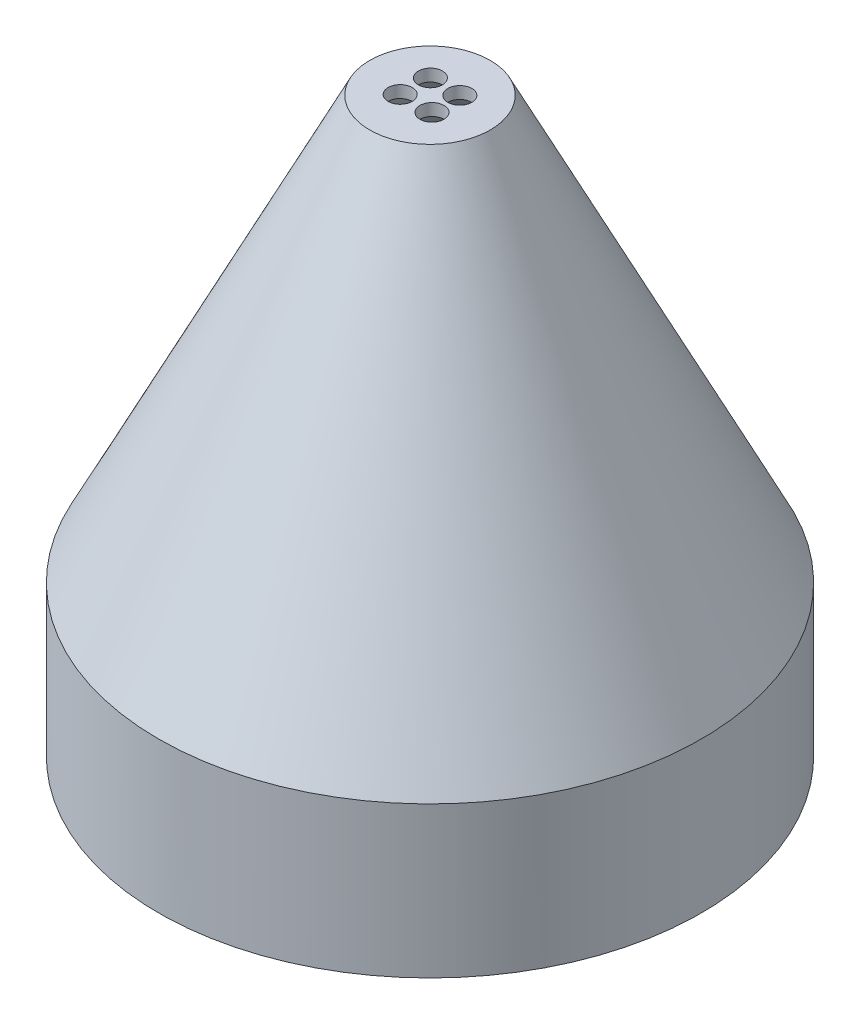
ISO-10303-21;
HEADER;
FILE_DESCRIPTION(('STEP AP214'),'2;1');
FILE_NAME('part.step','',(''),(''),'','','');
FILE_SCHEMA(('AUTOMOTIVE_DESIGN { 1 0 10303 214 1 1 1 1 }'));
ENDSEC;
DATA;
#1=APPLICATION_CONTEXT('core data for automotive mechanical design processes');
#2=APPLICATION_PROTOCOL_DEFINITION('international standard','automotive_design',2000,#1);
#3=PRODUCT_CONTEXT('',#1,'mechanical');
#4=PRODUCT('Part','Part','',(#3));
#5=PRODUCT_RELATED_PRODUCT_CATEGORY('part','',(#4));
#6=PRODUCT_DEFINITION_FORMATION('','',#4);
#7=PRODUCT_DEFINITION_CONTEXT('part definition',#1,'design');
#8=PRODUCT_DEFINITION('design','',#6,#7);
#9=PRODUCT_DEFINITION_SHAPE('','',#8);
#10=(LENGTH_UNIT() NAMED_UNIT(*) SI_UNIT(.MILLI.,.METRE.));
#11=(NAMED_UNIT(*) PLANE_ANGLE_UNIT() SI_UNIT($,.RADIAN.));
#12=(NAMED_UNIT(*) SI_UNIT($,.STERADIAN.) SOLID_ANGLE_UNIT());
#13=UNCERTAINTY_MEASURE_WITH_UNIT(LENGTH_MEASURE(1.E-05),#10,'distance_accuracy_value','');
#14=(GEOMETRIC_REPRESENTATION_CONTEXT(3) GLOBAL_UNCERTAINTY_ASSIGNED_CONTEXT((#13)) GLOBAL_UNIT_ASSIGNED_CONTEXT((#10,
#11,#12)) REPRESENTATION_CONTEXT('',''));
#15=CARTESIAN_POINT('',(0.,0.,0.));
#16=DIRECTION('',(0.,0.,1.));
#17=DIRECTION('',(1.,0.,0.));
#18=AXIS2_PLACEMENT_3D('',#15,#16,#17);
#19=CARTESIAN_POINT('',(0.,25.,0.));
#20=DIRECTION('',(0.,-1.,0.));
#21=DIRECTION('',(0.,0.,-1.));
#22=AXIS2_PLACEMENT_3D('',#19,#20,#21);
#23=CYLINDRICAL_SURFACE('',#22,45.);
#24=CARTESIAN_POINT('',(0.,25.,0.));
#25=DIRECTION('',(0.,1.,0.));
#26=DIRECTION('',(0.,0.,1.));
#27=AXIS2_PLACEMENT_3D('',#24,#25,#26);
#28=CIRCLE('',#27,45.);
#29=CARTESIAN_POINT('',(0.,25.,-45.));
#30=VERTEX_POINT('',#29);
#31=EDGE_CURVE('E11',#30,#30,#28,.T.);
#32=ORIENTED_EDGE('',*,*,#31,.F.);
#33=EDGE_LOOP('',(#32));
#34=FACE_BOUND('',#33,.T.);
#35=DIRECTION('',(0.,-1.,0.));
#36=VECTOR('',#35,1.);
#37=CARTESIAN_POINT('',(-16.1176463721255,3.,-42.0145388576753));
#38=LINE('',#37,#36);
#39=CARTESIAN_POINT('',(-16.1176463721255,3.,-42.0145388576753));
#40=VERTEX_POINT('',#39);
#41=CARTESIAN_POINT('',(-16.1176463721255,0.,-42.0145388576753));
#42=VERTEX_POINT('',#41);
#43=EDGE_CURVE('E53',#40,#42,#38,.T.);
#44=ORIENTED_EDGE('',*,*,#43,.F.);
#45=CARTESIAN_POINT('',(0.,3.,0.));
#46=DIRECTION('',(0.,1.,0.));
#47=DIRECTION('',(0.,0.,1.));
#48=AXIS2_PLACEMENT_3D('',#45,#46,#47);
#49=CIRCLE('',#48,45.);
#50=CARTESIAN_POINT('',(-45.,3.,0.));
#51=VERTEX_POINT('',#50);
#52=EDGE_CURVE('E58',#40,#51,#49,.T.);
#53=ORIENTED_EDGE('',*,*,#52,.T.);
#54=DIRECTION('',(0.,-1.,0.));
#55=VECTOR('',#54,1.);
#56=CARTESIAN_POINT('',(-45.,3.,0.));
#57=LINE('',#56,#55);
#58=CARTESIAN_POINT('',(-45.,0.,0.));
#59=VERTEX_POINT('',#58);
#60=EDGE_CURVE('E113',#51,#59,#57,.T.);
#61=ORIENTED_EDGE('',*,*,#60,.T.);
#62=CARTESIAN_POINT('',(0.,0.,0.));
#63=DIRECTION('',(0.,1.,0.));
#64=DIRECTION('',(0.,0.,1.));
#65=AXIS2_PLACEMENT_3D('',#62,#63,#64);
#66=CIRCLE('',#65,45.);
#67=EDGE_CURVE('E42',#59,#42,#66,.T.);
#68=ORIENTED_EDGE('',*,*,#67,.T.);
#69=EDGE_LOOP('',(#44,#53,#61,#68));
#70=FACE_BOUND('',#69,.T.);
#71=ADVANCED_FACE('F39',(#34,#70),#23,.T.);
#72=CARTESIAN_POINT('',(0.,0.,0.));
#73=DIRECTION('',(0.,1.,0.));
#74=DIRECTION('',(0.,0.,1.));
#75=AXIS2_PLACEMENT_3D('',#72,#73,#74);
#76=PLANE('',#75);
#77=ORIENTED_EDGE('',*,*,#67,.F.);
#78=DIRECTION('',(-1.,0.,0.));
#79=VECTOR('',#78,1.);
#80=CARTESIAN_POINT('',(-45.,0.,0.));
#81=LINE('',#80,#79);
#82=CARTESIAN_POINT('',(-53.,0.,0.));
#83=VERTEX_POINT('',#82);
#84=EDGE_CURVE('E86',#59,#83,#81,.T.);
#85=ORIENTED_EDGE('',*,*,#84,.T.);
#86=CARTESIAN_POINT('',(-7.11905167453594,0.,-4.89297394403812));
#87=DIRECTION('',(0.,-1.,0.));
#88=DIRECTION('',(0.,0.,-1.));
#89=AXIS2_PLACEMENT_3D('',#86,#87,#88);
#90=CIRCLE('',#89,46.1411162983834);
#91=CARTESIAN_POINT('',(-18.9917099939509,0.,-49.4804452525948));
#92=VERTEX_POINT('',#91);
#93=EDGE_CURVE('E107',#83,#92,#90,.T.);
#94=ORIENTED_EDGE('',*,*,#93,.T.);
#95=DIRECTION('',(-0.35925795272818,0.,-0.933238299364935));
#96=VECTOR('',#95,1.);
#97=CARTESIAN_POINT('',(-16.1176463721255,0.,-42.0145388576753));
#98=LINE('',#97,#96);
#99=EDGE_CURVE('E92',#42,#92,#98,.T.);
#100=ORIENTED_EDGE('',*,*,#99,.F.);
#101=EDGE_LOOP('',(#77,#85,#94,#100));
#102=FACE_BOUND('',#101,.T.);
#103=CARTESIAN_POINT('',(0.,0.,0.));
#104=DIRECTION('',(0.,1.,0.));
#105=DIRECTION('',(0.,0.,1.));
#106=AXIS2_PLACEMENT_3D('',#103,#104,#105);
#107=CIRCLE('',#106,43.5);
#108=CARTESIAN_POINT('',(0.,0.,43.5));
#109=VERTEX_POINT('',#108);
#110=EDGE_CURVE('E96',#109,#109,#107,.T.);
#111=ORIENTED_EDGE('',*,*,#110,.T.);
#112=EDGE_LOOP('',(#111));
#113=FACE_BOUND('',#112,.T.);
#114=ADVANCED_FACE('F124',(#102,#113),#76,.F.);
#115=CARTESIAN_POINT('',(0.,25.,0.));
#116=DIRECTION('',(0.,-1.,0.));
#117=DIRECTION('',(0.,0.,-1.));
#118=AXIS2_PLACEMENT_3D('',#115,#116,#117);
#119=CYLINDRICAL_SURFACE('',#118,43.5);
#120=CARTESIAN_POINT('',(0.,25.,0.));
#121=DIRECTION('',(0.,1.,0.));
#122=DIRECTION('',(0.,0.,1.));
#123=AXIS2_PLACEMENT_3D('',#120,#121,#122);
#124=CIRCLE('',#123,43.5);
#125=CARTESIAN_POINT('',(0.,25.,43.5));
#126=VERTEX_POINT('',#125);
#127=EDGE_CURVE('E108',#126,#126,#124,.T.);
#128=ORIENTED_EDGE('',*,*,#127,.T.);
#129=EDGE_LOOP('',(#128));
#130=FACE_BOUND('',#129,.T.);
#131=ORIENTED_EDGE('',*,*,#110,.F.);
#132=EDGE_LOOP('',(#131));
#133=FACE_BOUND('',#132,.T.);
#134=ADVANCED_FACE('F141',(#130,#133),#119,.F.);
#135=CARTESIAN_POINT('',(-16.1176463721255,3.,-42.0145388576753));
#136=DIRECTION('',(-0.933238299364935,0.,0.35925795272818));
#137=DIRECTION('',(0.35925795272818,0.,0.933238299364935));
#138=AXIS2_PLACEMENT_3D('',#135,#136,#137);
#139=PLANE('',#138);
#140=ORIENTED_EDGE('',*,*,#99,.T.);
#141=DIRECTION('',(0.,-1.,0.));
#142=VECTOR('',#141,1.);
#143=CARTESIAN_POINT('',(-18.9917099939509,3.,-49.4804452525948));
#144=LINE('',#143,#142);
#145=CARTESIAN_POINT('',(-18.9917099939509,3.,-49.4804452525948));
#146=VERTEX_POINT('',#145);
#147=EDGE_CURVE('E89',#146,#92,#144,.T.);
#148=ORIENTED_EDGE('',*,*,#147,.F.);
#149=DIRECTION('',(-0.35925795272818,0.,-0.933238299364935));
#150=VECTOR('',#149,1.);
#151=CARTESIAN_POINT('',(-16.1176463721255,3.,-42.0145388576753));
#152=LINE('',#151,#150);
#153=EDGE_CURVE('E78',#40,#146,#152,.T.);
#154=ORIENTED_EDGE('',*,*,#153,.F.);
#155=ORIENTED_EDGE('',*,*,#43,.T.);
#156=EDGE_LOOP('',(#140,#148,#154,#155));
#157=FACE_BOUND('',#156,.T.);
#158=ADVANCED_FACE('F90',(#157),#139,.F.);
#159=CARTESIAN_POINT('',(-7.11905167453594,3.,-4.89297394403812));
#160=DIRECTION('',(0.,-1.,0.));
#161=DIRECTION('',(0.,0.,-1.));
#162=AXIS2_PLACEMENT_3D('',#159,#160,#161);
#163=CYLINDRICAL_SURFACE('',#162,46.1411162983834);
#164=ORIENTED_EDGE('',*,*,#93,.F.);
#165=DIRECTION('',(0.,-1.,0.));
#166=VECTOR('',#165,1.);
#167=CARTESIAN_POINT('',(-53.,3.,0.));
#168=LINE('',#167,#166);
#169=CARTESIAN_POINT('',(-53.,3.,0.));
#170=VERTEX_POINT('',#169);
#171=EDGE_CURVE('E97',#170,#83,#168,.T.);
#172=ORIENTED_EDGE('',*,*,#171,.F.);
#173=CARTESIAN_POINT('',(-7.11905167453594,3.,-4.89297394403812));
#174=DIRECTION('',(0.,-1.,0.));
#175=DIRECTION('',(0.,0.,-1.));
#176=AXIS2_PLACEMENT_3D('',#173,#174,#175);
#177=CIRCLE('',#176,46.1411162983834);
#178=EDGE_CURVE('E83',#170,#146,#177,.T.);
#179=ORIENTED_EDGE('',*,*,#178,.T.);
#180=ORIENTED_EDGE('',*,*,#147,.T.);
#181=EDGE_LOOP('',(#164,#172,#179,#180));
#182=FACE_BOUND('',#181,.T.);
#183=ADVANCED_FACE('F99',(#182),#163,.T.);
#184=CARTESIAN_POINT('',(-45.,3.,0.));
#185=DIRECTION('',(0.,0.,1.));
#186=DIRECTION('',(1.,0.,0.));
#187=AXIS2_PLACEMENT_3D('',#184,#185,#186);
#188=PLANE('',#187);
#189=ORIENTED_EDGE('',*,*,#84,.F.);
#190=ORIENTED_EDGE('',*,*,#60,.F.);
#191=DIRECTION('',(-1.,0.,0.));
#192=VECTOR('',#191,1.);
#193=CARTESIAN_POINT('',(-45.,3.,0.));
#194=LINE('',#193,#192);
#195=EDGE_CURVE('E100',#51,#170,#194,.T.);
#196=ORIENTED_EDGE('',*,*,#195,.T.);
#197=ORIENTED_EDGE('',*,*,#171,.T.);
#198=EDGE_LOOP('',(#189,#190,#196,#197));
#199=FACE_BOUND('',#198,.T.);
#200=ADVANCED_FACE('F126',(#199),#188,.T.);
#201=CARTESIAN_POINT('',(-7.11905167453594,3.,-4.89297394403812));
#202=DIRECTION('',(0.,-1.,0.));
#203=DIRECTION('',(0.,0.,-1.));
#204=AXIS2_PLACEMENT_3D('',#201,#202,#203);
#205=PLANE('',#204);
#206=ORIENTED_EDGE('',*,*,#153,.T.);
#207=ORIENTED_EDGE('',*,*,#178,.F.);
#208=ORIENTED_EDGE('',*,*,#195,.F.);
#209=ORIENTED_EDGE('',*,*,#52,.F.);
#210=EDGE_LOOP('',(#206,#207,#208,#209));
#211=FACE_BOUND('',#210,.T.);
#212=ADVANCED_FACE('F80',(#211),#205,.F.);
#213=CARTESIAN_POINT('',(-45.,25.,0.));
#214=DIRECTION('',(0.,1.,0.));
#215=DIRECTION('',(0.,0.,1.));
#216=AXIS2_PLACEMENT_3D('',#213,#214,#215);
#217=PLANE('',#216);
#218=CARTESIAN_POINT('',(0.,25.,0.));
#219=DIRECTION('',(0.,1.,0.));
#220=DIRECTION('',(0.,0.,1.));
#221=AXIS2_PLACEMENT_3D('',#218,#219,#220);
#222=CIRCLE('',#221,42.7639320225002);
#223=CARTESIAN_POINT('',(0.,25.,-42.7639320225002));
#224=VERTEX_POINT('',#223);
#225=EDGE_CURVE('E152',#224,#224,#222,.T.);
#226=ORIENTED_EDGE('',*,*,#225,.T.);
#227=EDGE_LOOP('',(#226));
#228=FACE_BOUND('',#227,.T.);
#229=ORIENTED_EDGE('',*,*,#127,.F.);
#230=EDGE_LOOP('',(#229));
#231=FACE_BOUND('',#230,.T.);
#232=ADVANCED_FACE('F133',(#228,#231),#217,.F.);
#233=CARTESIAN_POINT('',(0.,95.,0.));
#234=DIRECTION('',(0.,-1.,0.));
#235=DIRECTION('',(0.,0.,-1.));
#236=AXIS2_PLACEMENT_3D('',#233,#234,#235);
#237=CONICAL_SURFACE('',#236,10.,0.463647609000806);
#238=CARTESIAN_POINT('',(0.,95.,0.));
#239=DIRECTION('',(0.,-1.,0.));
#240=DIRECTION('',(0.,0.,-1.));
#241=AXIS2_PLACEMENT_3D('',#238,#239,#240);
#242=CIRCLE('',#241,10.);
#243=CARTESIAN_POINT('',(0.,95.,-10.));
#244=VERTEX_POINT('',#243);
#245=EDGE_CURVE('E118',#244,#244,#242,.T.);
#246=CARTESIAN_POINT('',(0.,25.,-45.));
#247=CARTESIAN_POINT('',(0.,25.7291666666667,-44.6354166666667));
#248=CARTESIAN_POINT('',(0.,26.4583333333333,-44.2708333333333));
#249=CARTESIAN_POINT('',(0.,27.9166666666667,-43.5416666666667));
#250=CARTESIAN_POINT('',(0.,28.6458333333333,-43.1770833333333));
#251=CARTESIAN_POINT('',(0.,30.1041666666667,-42.4479166666667));
#252=CARTESIAN_POINT('',(0.,30.8333333333333,-42.0833333333333));
#253=CARTESIAN_POINT('',(0.,32.2916666666667,-41.3541666666667));
#254=CARTESIAN_POINT('',(0.,33.0208333333333,-40.9895833333333));
#255=CARTESIAN_POINT('',(0.,34.4791666666667,-40.2604166666667));
#256=CARTESIAN_POINT('',(0.,35.2083333333333,-39.8958333333333));
#257=CARTESIAN_POINT('',(0.,36.6666666666667,-39.1666666666667));
#258=CARTESIAN_POINT('',(0.,37.3958333333333,-38.8020833333333));
#259=CARTESIAN_POINT('',(0.,38.8541666666667,-38.0729166666667));
#260=CARTESIAN_POINT('',(0.,39.5833333333333,-37.7083333333333));
#261=CARTESIAN_POINT('',(0.,41.0416666666667,-36.9791666666667));
#262=CARTESIAN_POINT('',(0.,41.7708333333333,-36.6145833333333));
#263=CARTESIAN_POINT('',(0.,43.2291666666667,-35.8854166666667));
#264=CARTESIAN_POINT('',(0.,43.9583333333333,-35.5208333333333));
#265=CARTESIAN_POINT('',(0.,45.4166666666667,-34.7916666666667));
#266=CARTESIAN_POINT('',(0.,46.1458333333333,-34.4270833333333));
#267=CARTESIAN_POINT('',(0.,47.6041666666667,-33.6979166666667));
#268=CARTESIAN_POINT('',(0.,48.3333333333333,-33.3333333333333));
#269=CARTESIAN_POINT('',(0.,49.7916666666667,-32.6041666666667));
#270=CARTESIAN_POINT('',(0.,50.5208333333333,-32.2395833333333));
#271=CARTESIAN_POINT('',(0.,51.9791666666667,-31.5104166666667));
#272=CARTESIAN_POINT('',(0.,52.7083333333333,-31.1458333333333));
#273=CARTESIAN_POINT('',(0.,54.1666666666667,-30.4166666666667));
#274=CARTESIAN_POINT('',(0.,54.8958333333333,-30.0520833333333));
#275=CARTESIAN_POINT('',(0.,56.3541666666667,-29.3229166666667));
#276=CARTESIAN_POINT('',(0.,57.0833333333333,-28.9583333333333));
#277=CARTESIAN_POINT('',(0.,58.5416666666667,-28.2291666666667));
#278=CARTESIAN_POINT('',(0.,59.2708333333333,-27.8645833333333));
#279=CARTESIAN_POINT('',(0.,60.7291666666667,-27.1354166666667));
#280=CARTESIAN_POINT('',(0.,61.4583333333333,-26.7708333333333));
#281=CARTESIAN_POINT('',(0.,62.9166666666667,-26.0416666666667));
#282=CARTESIAN_POINT('',(0.,63.6458333333333,-25.6770833333333));
#283=CARTESIAN_POINT('',(0.,65.1041666666667,-24.9479166666667));
#284=CARTESIAN_POINT('',(0.,65.8333333333333,-24.5833333333333));
#285=CARTESIAN_POINT('',(0.,67.2916666666667,-23.8541666666667));
#286=CARTESIAN_POINT('',(0.,68.0208333333333,-23.4895833333333));
#287=CARTESIAN_POINT('',(0.,69.4791666666667,-22.7604166666667));
#288=CARTESIAN_POINT('',(0.,70.2083333333333,-22.3958333333333));
#289=CARTESIAN_POINT('',(0.,71.6666666666667,-21.6666666666667));
#290=CARTESIAN_POINT('',(0.,72.3958333333333,-21.3020833333333));
#291=CARTESIAN_POINT('',(0.,73.8541666666667,-20.5729166666667));
#292=CARTESIAN_POINT('',(0.,74.5833333333333,-20.2083333333333));
#293=CARTESIAN_POINT('',(0.,76.0416666666667,-19.4791666666667));
#294=CARTESIAN_POINT('',(0.,76.7708333333333,-19.1145833333333));
#295=CARTESIAN_POINT('',(0.,78.2291666666667,-18.3854166666667));
#296=CARTESIAN_POINT('',(0.,78.9583333333333,-18.0208333333333));
#297=CARTESIAN_POINT('',(0.,80.4166666666667,-17.2916666666667));
#298=CARTESIAN_POINT('',(0.,81.1458333333333,-16.9270833333333));
#299=CARTESIAN_POINT('',(0.,82.6041666666667,-16.1979166666667));
#300=CARTESIAN_POINT('',(0.,83.3333333333333,-15.8333333333333));
#301=CARTESIAN_POINT('',(0.,84.7916666666667,-15.1041666666667));
#302=CARTESIAN_POINT('',(0.,85.5208333333333,-14.7395833333333));
#303=CARTESIAN_POINT('',(0.,86.9791666666667,-14.0104166666667));
#304=CARTESIAN_POINT('',(0.,87.7083333333333,-13.6458333333333));
#305=CARTESIAN_POINT('',(0.,89.1666666666667,-12.9166666666667));
#306=CARTESIAN_POINT('',(0.,89.8958333333333,-12.5520833333333));
#307=CARTESIAN_POINT('',(0.,91.3541666666667,-11.8229166666667));
#308=CARTESIAN_POINT('',(0.,92.0833333333333,-11.4583333333333));
#309=CARTESIAN_POINT('',(0.,93.5416666666667,-10.7291666666667));
#310=CARTESIAN_POINT('',(0.,94.2708333333333,-10.3645833333333));
#311=CARTESIAN_POINT('',(0.,95.,-10.));
#312=B_SPLINE_CURVE_WITH_KNOTS('',3,(#246,#247,#248,#249,#250,#251,#252,#253,#254,#255,#256,
#257,#258,#259,#260,#261,#262,#263,#264,#265,#266,#267,#268,#269,#270,#271,#272,#273,#274,#275,
#276,#277,#278,#279,#280,#281,#282,#283,#284,#285,#286,#287,#288,#289,#290,#291,#292,#293,#294,
#295,#296,#297,#298,#299,#300,#301,#302,#303,#304,#305,#306,#307,#308,#309,#310,#311),
.UNSPECIFIED.,.F.,.F.,(4,2,2,2,2,2,2,2,2,2,2,2,2,2,2,2,2,2,2,2,2,2,2,2,2,2,2,2,2,2,2,2,4),(0.,
2.44569935039039,4.89139870078079,7.33709805117118,9.78279740156158,12.228496751952,
14.6741961023424,17.1198954527328,19.5655948031232,22.0112941535136,24.456993503904,
26.9026928542944,29.3483922046847,31.7940915550751,34.2397909054655,36.6854902558559,
39.1311896062463,41.5768889566367,44.0225883070271,46.4682876574175,48.9139870078079,
51.3596863581983,53.8053857085887,56.2510850589791,58.6967844093695,61.1424837597599,
63.5881831101503,66.0338824605407,68.4795818109311,70.9252811613215,73.3709805117119,
75.8166798621023,78.2623792124927),.UNSPECIFIED.);
#313=EDGE_CURVE('BSEAM144',#30,#244,#312,.T.);
#314=ORIENTED_EDGE('',*,*,#31,.T.);
#315=ORIENTED_EDGE('',*,*,#245,.T.);
#316=ORIENTED_EDGE('',*,*,#313,.T.);
#317=ORIENTED_EDGE('',*,*,#313,.F.);
#318=EDGE_LOOP('',(#314,#316,#315,#317));
#319=FACE_BOUND('',#318,.T.);
#320=ADVANCED_FACE('F144',(#319),#237,.T.);
#321=CARTESIAN_POINT('',(0.,95.,0.));
#322=DIRECTION('',(0.,-1.,0.));
#323=DIRECTION('',(0.,0.,-1.));
#324=AXIS2_PLACEMENT_3D('',#321,#322,#323);
#325=PLANE('',#324);
#326=CARTESIAN_POINT('',(2.63209110046279,95.,2.30696693493092));
#327=DIRECTION('',(0.,-1.,0.));
#328=DIRECTION('',(0.,0.,-1.));
#329=AXIS2_PLACEMENT_3D('',#326,#327,#328);
#330=CIRCLE('',#329,2.);
#331=CARTESIAN_POINT('',(2.63209110046279,95.,0.306966934930923));
#332=VERTEX_POINT('',#331);
#333=EDGE_CURVE('E159',#332,#332,#330,.T.);
#334=ORIENTED_EDGE('',*,*,#333,.T.);
#335=EDGE_LOOP('',(#334));
#336=FACE_BOUND('',#335,.T.);
#337=CARTESIAN_POINT('',(-2.44349618389529,95.,-2.50585841565104));
#338=DIRECTION('',(0.,-1.,0.));
#339=DIRECTION('',(0.,0.,-1.));
#340=AXIS2_PLACEMENT_3D('',#337,#338,#339);
#341=CIRCLE('',#340,2.);
#342=CARTESIAN_POINT('',(-2.44349618389529,95.,-4.50585841565104));
#343=VERTEX_POINT('',#342);
#344=EDGE_CURVE('E162',#343,#343,#341,.T.);
#345=ORIENTED_EDGE('',*,*,#344,.T.);
#346=EDGE_LOOP('',(#345));
#347=FACE_BOUND('',#346,.T.);
#348=CARTESIAN_POINT('',(2.50484369712798,95.,-2.44453636768984));
#349=DIRECTION('',(0.,-1.,0.));
#350=DIRECTION('',(0.,0.,-1.));
#351=AXIS2_PLACEMENT_3D('',#348,#349,#350);
#352=CIRCLE('',#351,2.);
#353=CARTESIAN_POINT('',(2.50484369712798,95.,-4.44453636768984));
#354=VERTEX_POINT('',#353);
#355=EDGE_CURVE('E165',#354,#354,#352,.T.);
#356=ORIENTED_EDGE('',*,*,#355,.T.);
#357=EDGE_LOOP('',(#356));
#358=FACE_BOUND('',#357,.T.);
#359=CARTESIAN_POINT('',(-2.57444868424894,95.,2.37112082614296));
#360=DIRECTION('',(0.,-1.,0.));
#361=DIRECTION('',(0.,0.,-1.));
#362=AXIS2_PLACEMENT_3D('',#359,#360,#361);
#363=CIRCLE('',#362,2.);
#364=CARTESIAN_POINT('',(-2.57444868424894,95.,0.371120826142964));
#365=VERTEX_POINT('',#364);
#366=EDGE_CURVE('E168',#365,#365,#363,.T.);
#367=ORIENTED_EDGE('',*,*,#366,.T.);
#368=EDGE_LOOP('',(#367));
#369=FACE_BOUND('',#368,.T.);
#370=ORIENTED_EDGE('',*,*,#245,.F.);
#371=EDGE_LOOP('',(#370));
#372=FACE_BOUND('',#371,.T.);
#373=ADVANCED_FACE('F147',(#336,#347,#358,#369,#372),#325,.F.);
#374=CARTESIAN_POINT('',(0.,94.1055728090001,0.));
#375=DIRECTION('',(0.,-1.,0.));
#376=DIRECTION('',(0.,0.,-1.));
#377=AXIS2_PLACEMENT_3D('',#374,#375,#376);
#378=CONICAL_SURFACE('',#377,8.21114561800017,0.463647609000806);
#379=CARTESIAN_POINT('',(0.,93.,0.));
#380=DIRECTION('',(0.,-1.,0.));
#381=DIRECTION('',(0.,0.,-1.));
#382=AXIS2_PLACEMENT_3D('',#379,#380,#381);
#383=CIRCLE('',#382,8.7639320225002);
#384=CARTESIAN_POINT('',(0.,93.,-8.7639320225002));
#385=VERTEX_POINT('',#384);
#386=EDGE_CURVE('E154',#385,#385,#383,.T.);
#387=CARTESIAN_POINT('',(0.,93.,-8.7639320225002));
#388=CARTESIAN_POINT('',(0.,92.2916666666667,-9.11809868916687));
#389=CARTESIAN_POINT('',(0.,91.5833333333334,-9.47226535583354));
#390=CARTESIAN_POINT('',(0.,90.1666666666667,-10.1805986891669));
#391=CARTESIAN_POINT('',(0.,89.4583333333334,-10.5347653558335));
#392=CARTESIAN_POINT('',(0.,88.0416666666667,-11.2430986891669));
#393=CARTESIAN_POINT('',(0.,87.3333333333334,-11.5972653558335));
#394=CARTESIAN_POINT('',(0.,85.9166666666667,-12.3055986891669));
#395=CARTESIAN_POINT('',(0.,85.2083333333334,-12.6597653558335));
#396=CARTESIAN_POINT('',(0.,83.7916666666667,-13.3680986891669));
#397=CARTESIAN_POINT('',(0.,83.0833333333334,-13.7222653558335));
#398=CARTESIAN_POINT('',(0.,81.6666666666667,-14.4305986891669));
#399=CARTESIAN_POINT('',(0.,80.9583333333334,-14.7847653558335));
#400=CARTESIAN_POINT('',(0.,79.5416666666667,-15.4930986891669));
#401=CARTESIAN_POINT('',(0.,78.8333333333334,-15.8472653558335));
#402=CARTESIAN_POINT('',(0.,77.4166666666667,-16.5555986891669));
#403=CARTESIAN_POINT('',(0.,76.7083333333334,-16.9097653558335));
#404=CARTESIAN_POINT('',(0.,75.2916666666667,-17.6180986891669));
#405=CARTESIAN_POINT('',(0.,74.5833333333333,-17.9722653558335));
#406=CARTESIAN_POINT('',(0.,73.1666666666667,-18.6805986891669));
#407=CARTESIAN_POINT('',(0.,72.4583333333333,-19.0347653558335));
#408=CARTESIAN_POINT('',(0.,71.0416666666667,-19.7430986891669));
#409=CARTESIAN_POINT('',(0.,70.3333333333333,-20.0972653558335));
#410=CARTESIAN_POINT('',(0.,68.9166666666667,-20.8055986891669));
#411=CARTESIAN_POINT('',(0.,68.2083333333333,-21.1597653558335));
#412=CARTESIAN_POINT('',(0.,66.7916666666667,-21.8680986891669));
#413=CARTESIAN_POINT('',(0.,66.0833333333333,-22.2222653558335));
#414=CARTESIAN_POINT('',(0.,64.6666666666667,-22.9305986891669));
#415=CARTESIAN_POINT('',(0.,63.9583333333333,-23.2847653558335));
#416=CARTESIAN_POINT('',(0.,62.5416666666667,-23.9930986891669));
#417=CARTESIAN_POINT('',(0.,61.8333333333333,-24.3472653558335));
#418=CARTESIAN_POINT('',(0.,60.4166666666667,-25.0555986891669));
#419=CARTESIAN_POINT('',(0.,59.7083333333333,-25.4097653558335));
#420=CARTESIAN_POINT('',(0.,58.2916666666667,-26.1180986891669));
#421=CARTESIAN_POINT('',(0.,57.5833333333333,-26.4722653558335));
#422=CARTESIAN_POINT('',(0.,56.1666666666667,-27.1805986891669));
#423=CARTESIAN_POINT('',(0.,55.4583333333333,-27.5347653558335));
#424=CARTESIAN_POINT('',(0.,54.0416666666667,-28.2430986891669));
#425=CARTESIAN_POINT('',(0.,53.3333333333333,-28.5972653558335));
#426=CARTESIAN_POINT('',(0.,51.9166666666667,-29.3055986891669));
#427=CARTESIAN_POINT('',(0.,51.2083333333333,-29.6597653558335));
#428=CARTESIAN_POINT('',(0.,49.7916666666667,-30.3680986891669));
#429=CARTESIAN_POINT('',(0.,49.0833333333333,-30.7222653558335));
#430=CARTESIAN_POINT('',(0.,47.6666666666667,-31.4305986891669));
#431=CARTESIAN_POINT('',(0.,46.9583333333333,-31.7847653558335));
#432=CARTESIAN_POINT('',(0.,45.5416666666667,-32.4930986891669));
#433=CARTESIAN_POINT('',(0.,44.8333333333333,-32.8472653558335));
#434=CARTESIAN_POINT('',(0.,43.4166666666667,-33.5555986891669));
#435=CARTESIAN_POINT('',(0.,42.7083333333333,-33.9097653558335));
#436=CARTESIAN_POINT('',(0.,41.2916666666667,-34.6180986891669));
#437=CARTESIAN_POINT('',(0.,40.5833333333333,-34.9722653558335));
#438=CARTESIAN_POINT('',(0.,39.1666666666667,-35.6805986891669));
#439=CARTESIAN_POINT('',(0.,38.4583333333333,-36.0347653558335));
#440=CARTESIAN_POINT('',(0.,37.0416666666667,-36.7430986891669));
#441=CARTESIAN_POINT('',(0.,36.3333333333333,-37.0972653558335));
#442=CARTESIAN_POINT('',(0.,34.9166666666667,-37.8055986891669));
#443=CARTESIAN_POINT('',(0.,34.2083333333333,-38.1597653558335));
#444=CARTESIAN_POINT('',(0.,32.7916666666667,-38.8680986891669));
#445=CARTESIAN_POINT('',(0.,32.0833333333333,-39.2222653558335));
#446=CARTESIAN_POINT('',(0.,30.6666666666667,-39.9305986891669));
#447=CARTESIAN_POINT('',(0.,29.9583333333333,-40.2847653558335));
#448=CARTESIAN_POINT('',(0.,28.5416666666667,-40.9930986891669));
#449=CARTESIAN_POINT('',(0.,27.8333333333333,-41.3472653558335));
#450=CARTESIAN_POINT('',(0.,26.4166666666667,-42.0555986891669));
#451=CARTESIAN_POINT('',(0.,25.7083333333333,-42.4097653558335));
#452=CARTESIAN_POINT('',(0.,25.,-42.7639320225002));
#453=B_SPLINE_CURVE_WITH_KNOTS('',3,(#387,#388,#389,#390,#391,#392,#393,#394,#395,#396,#397,
#398,#399,#400,#401,#402,#403,#404,#405,#406,#407,#408,#409,#410,#411,#412,#413,#414,#415,#416,
#417,#418,#419,#420,#421,#422,#423,#424,#425,#426,#427,#428,#429,#430,#431,#432,#433,#434,#435,
#436,#437,#438,#439,#440,#441,#442,#443,#444,#445,#446,#447,#448,#449,#450,#451,#452),
.UNSPECIFIED.,.F.,.F.,(4,2,2,2,2,2,2,2,2,2,2,2,2,2,2,2,2,2,2,2,2,2,2,2,2,2,2,2,2,2,2,2,4),(0.,
2.37582222609353,4.75164445218706,7.12746667828059,9.50328890437411,11.8791111304676,
14.2549333565612,16.6307555826547,19.0065778087482,21.3824000348418,23.7582222609353,
26.1340444870288,28.5098667131223,30.8856889392159,33.2615111653094,35.6373333914029,
38.0131556174965,40.38897784359,42.7648000696835,45.140622295777,47.5164445218706,
49.8922667479641,52.2680889740576,54.6439112001512,57.0197334262447,59.3955556523382,
61.7713778784318,64.1472001045253,66.5230223306188,68.8988445567123,71.2746667828059,
73.6504890088994,76.0263112349929),.UNSPECIFIED.);
#454=EDGE_CURVE('BSEAM191',#385,#224,#453,.T.);
#455=ORIENTED_EDGE('',*,*,#386,.F.);
#456=ORIENTED_EDGE('',*,*,#225,.F.);
#457=ORIENTED_EDGE('',*,*,#454,.T.);
#458=ORIENTED_EDGE('',*,*,#454,.F.);
#459=EDGE_LOOP('',(#455,#457,#456,#458));
#460=FACE_BOUND('',#459,.T.);
#461=ADVANCED_FACE('F191',(#460),#378,.F.);
#462=CARTESIAN_POINT('',(0.,93.,0.));
#463=DIRECTION('',(0.,-1.,0.));
#464=DIRECTION('',(0.,0.,-1.));
#465=AXIS2_PLACEMENT_3D('',#462,#463,#464);
#466=PLANE('',#465);
#467=CARTESIAN_POINT('',(2.63209110046279,93.,2.30696693493092));
#468=DIRECTION('',(0.,-1.,0.));
#469=DIRECTION('',(0.,0.,-1.));
#470=AXIS2_PLACEMENT_3D('',#467,#468,#469);
#471=CIRCLE('',#470,2.);
#472=CARTESIAN_POINT('',(2.63209110046279,93.,0.306966934930923));
#473=VERTEX_POINT('',#472);
#474=EDGE_CURVE('E174',#473,#473,#471,.T.);
#475=ORIENTED_EDGE('',*,*,#474,.F.);
#476=EDGE_LOOP('',(#475));
#477=FACE_BOUND('',#476,.T.);
#478=CARTESIAN_POINT('',(-2.44349618389529,93.,-2.50585841565104));
#479=DIRECTION('',(0.,-1.,0.));
#480=DIRECTION('',(0.,0.,-1.));
#481=AXIS2_PLACEMENT_3D('',#478,#479,#480);
#482=CIRCLE('',#481,2.);
#483=CARTESIAN_POINT('',(-2.44349618389529,93.,-4.50585841565104));
#484=VERTEX_POINT('',#483);
#485=EDGE_CURVE('E175',#484,#484,#482,.T.);
#486=ORIENTED_EDGE('',*,*,#485,.F.);
#487=EDGE_LOOP('',(#486));
#488=FACE_BOUND('',#487,.T.);
#489=CARTESIAN_POINT('',(2.50484369712798,93.,-2.44453636768984));
#490=DIRECTION('',(0.,-1.,0.));
#491=DIRECTION('',(0.,0.,-1.));
#492=AXIS2_PLACEMENT_3D('',#489,#490,#491);
#493=CIRCLE('',#492,2.);
#494=CARTESIAN_POINT('',(2.50484369712798,93.,-4.44453636768984));
#495=VERTEX_POINT('',#494);
#496=EDGE_CURVE('E178',#495,#495,#493,.T.);
#497=ORIENTED_EDGE('',*,*,#496,.F.);
#498=EDGE_LOOP('',(#497));
#499=FACE_BOUND('',#498,.T.);
#500=CARTESIAN_POINT('',(-2.57444868424894,93.,2.37112082614296));
#501=DIRECTION('',(0.,-1.,0.));
#502=DIRECTION('',(0.,0.,-1.));
#503=AXIS2_PLACEMENT_3D('',#500,#501,#502);
#504=CIRCLE('',#503,2.);
#505=CARTESIAN_POINT('',(-2.57444868424894,93.,0.371120826142964));
#506=VERTEX_POINT('',#505);
#507=EDGE_CURVE('E171',#506,#506,#504,.T.);
#508=ORIENTED_EDGE('',*,*,#507,.F.);
#509=EDGE_LOOP('',(#508));
#510=FACE_BOUND('',#509,.T.);
#511=ORIENTED_EDGE('',*,*,#386,.T.);
#512=EDGE_LOOP('',(#511));
#513=FACE_BOUND('',#512,.T.);
#514=ADVANCED_FACE('F187',(#477,#488,#499,#510,#513),#466,.T.);
#515=CARTESIAN_POINT('',(-2.57444868424894,96.,2.37112082614296));
#516=DIRECTION('',(0.,-1.,0.));
#517=DIRECTION('',(0.,0.,-1.));
#518=AXIS2_PLACEMENT_3D('',#515,#516,#517);
#519=CYLINDRICAL_SURFACE('',#518,2.);
#520=ORIENTED_EDGE('',*,*,#507,.T.);
#521=EDGE_LOOP('',(#520));
#522=FACE_BOUND('',#521,.T.);
#523=ORIENTED_EDGE('',*,*,#366,.F.);
#524=EDGE_LOOP('',(#523));
#525=FACE_BOUND('',#524,.T.);
#526=ADVANCED_FACE('F190',(#522,#525),#519,.F.);
#527=CARTESIAN_POINT('',(2.50484369712798,96.,-2.44453636768984));
#528=DIRECTION('',(0.,-1.,0.));
#529=DIRECTION('',(0.,0.,-1.));
#530=AXIS2_PLACEMENT_3D('',#527,#528,#529);
#531=CYLINDRICAL_SURFACE('',#530,2.);
#532=ORIENTED_EDGE('',*,*,#496,.T.);
#533=EDGE_LOOP('',(#532));
#534=FACE_BOUND('',#533,.T.);
#535=ORIENTED_EDGE('',*,*,#355,.F.);
#536=EDGE_LOOP('',(#535));
#537=FACE_BOUND('',#536,.T.);
#538=ADVANCED_FACE('F184',(#534,#537),#531,.F.);
#539=CARTESIAN_POINT('',(-2.44349618389529,96.,-2.50585841565104));
#540=DIRECTION('',(0.,-1.,0.));
#541=DIRECTION('',(0.,0.,-1.));
#542=AXIS2_PLACEMENT_3D('',#539,#540,#541);
#543=CYLINDRICAL_SURFACE('',#542,2.);
#544=ORIENTED_EDGE('',*,*,#485,.T.);
#545=EDGE_LOOP('',(#544));
#546=FACE_BOUND('',#545,.T.);
#547=ORIENTED_EDGE('',*,*,#344,.F.);
#548=EDGE_LOOP('',(#547));
#549=FACE_BOUND('',#548,.T.);
#550=ADVANCED_FACE('F292',(#546,#549),#543,.F.);
#551=CARTESIAN_POINT('',(2.63209110046279,96.,2.30696693493092));
#552=DIRECTION('',(0.,-1.,0.));
#553=DIRECTION('',(0.,0.,-1.));
#554=AXIS2_PLACEMENT_3D('',#551,#552,#553);
#555=CYLINDRICAL_SURFACE('',#554,2.);
#556=ORIENTED_EDGE('',*,*,#474,.T.);
#557=EDGE_LOOP('',(#556));
#558=FACE_BOUND('',#557,.T.);
#559=ORIENTED_EDGE('',*,*,#333,.F.);
#560=EDGE_LOOP('',(#559));
#561=FACE_BOUND('',#560,.T.);
#562=ADVANCED_FACE('F302',(#558,#561),#555,.F.);
#563=CLOSED_SHELL('',(#71,#114,#134,#158,#183,#200,#212,#232,#320,#373,#461,#514,#526,#538,#550,#562));
#564=MANIFOLD_SOLID_BREP('B2',#563);
#565=ADVANCED_BREP_SHAPE_REPRESENTATION('',(#18,#564),#14);
#566=SHAPE_DEFINITION_REPRESENTATION(#9,#565);
ENDSEC;
END-ISO-10303-21;
